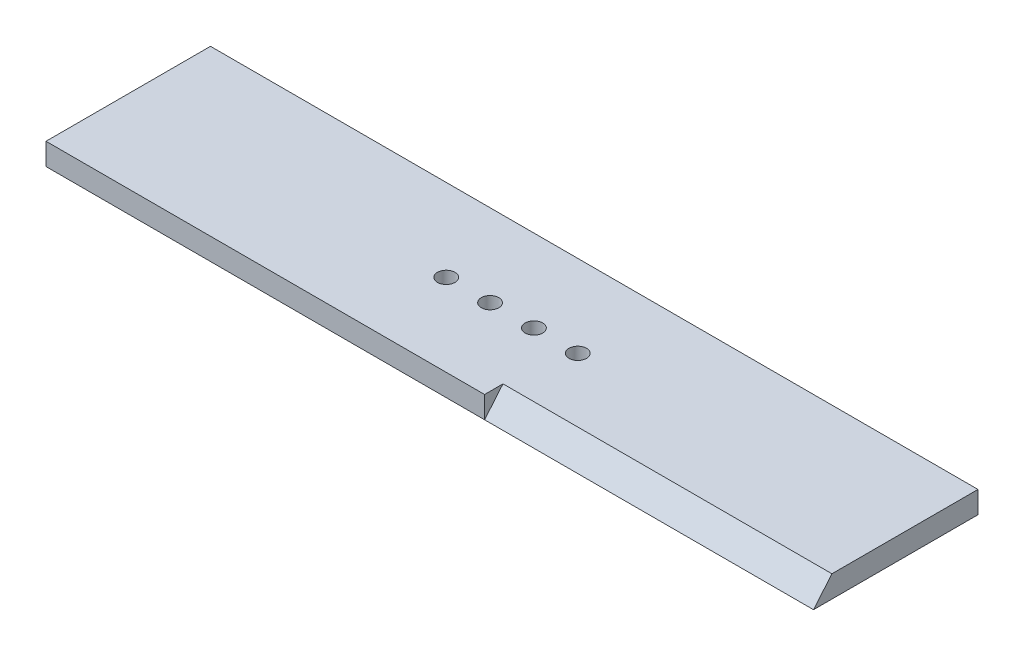
ISO-10303-21;
HEADER;
FILE_DESCRIPTION(('STEP AP214'),'2;1');
FILE_NAME('part.step','',(''),(''),'','','');
FILE_SCHEMA(('AUTOMOTIVE_DESIGN { 1 0 10303 214 1 1 1 1 }'));
ENDSEC;
DATA;
#1=APPLICATION_CONTEXT('core data for automotive mechanical design processes');
#2=APPLICATION_PROTOCOL_DEFINITION('international standard','automotive_design',2000,#1);
#3=PRODUCT_CONTEXT('',#1,'mechanical');
#4=PRODUCT('Part','Part','',(#3));
#5=PRODUCT_RELATED_PRODUCT_CATEGORY('part','',(#4));
#6=PRODUCT_DEFINITION_FORMATION('','',#4);
#7=PRODUCT_DEFINITION_CONTEXT('part definition',#1,'design');
#8=PRODUCT_DEFINITION('design','',#6,#7);
#9=PRODUCT_DEFINITION_SHAPE('','',#8);
#10=(LENGTH_UNIT() NAMED_UNIT(*) SI_UNIT(.MILLI.,.METRE.));
#11=(NAMED_UNIT(*) PLANE_ANGLE_UNIT() SI_UNIT($,.RADIAN.));
#12=(NAMED_UNIT(*) SI_UNIT($,.STERADIAN.) SOLID_ANGLE_UNIT());
#13=UNCERTAINTY_MEASURE_WITH_UNIT(LENGTH_MEASURE(1.E-05),#10,'distance_accuracy_value','');
#14=(GEOMETRIC_REPRESENTATION_CONTEXT(3) GLOBAL_UNCERTAINTY_ASSIGNED_CONTEXT((#13)) GLOBAL_UNIT_ASSIGNED_CONTEXT((#10,
#11,#12)) REPRESENTATION_CONTEXT('',''));
#15=CARTESIAN_POINT('',(0.,0.,0.));
#16=DIRECTION('',(0.,0.,1.));
#17=DIRECTION('',(1.,0.,0.));
#18=AXIS2_PLACEMENT_3D('',#15,#16,#17);
#19=CARTESIAN_POINT('',(-175.,5.,37.5));
#20=DIRECTION('',(0.,0.,-1.));
#21=DIRECTION('',(-1.,0.,0.));
#22=AXIS2_PLACEMENT_3D('',#19,#20,#21);
#23=PLANE('',#22);
#24=DIRECTION('',(0.,-1.,0.));
#25=VECTOR('',#24,1.);
#26=CARTESIAN_POINT('',(25.,5.,37.5));
#27=LINE('',#26,#25);
#28=CARTESIAN_POINT('',(25.,5.,37.5));
#29=VERTEX_POINT('',#28);
#30=CARTESIAN_POINT('',(25.,-5.,37.5));
#31=VERTEX_POINT('',#30);
#32=EDGE_CURVE('E179',#29,#31,#27,.T.);
#33=ORIENTED_EDGE('',*,*,#32,.F.);
#34=DIRECTION('',(1.,0.,0.));
#35=VECTOR('',#34,1.);
#36=CARTESIAN_POINT('',(-175.,5.,37.5));
#37=LINE('',#36,#35);
#38=CARTESIAN_POINT('',(-175.,5.,37.5));
#39=VERTEX_POINT('',#38);
#40=EDGE_CURVE('E135',#39,#29,#37,.T.);
#41=ORIENTED_EDGE('',*,*,#40,.F.);
#42=DIRECTION('',(0.,-1.,0.));
#43=VECTOR('',#42,1.);
#44=CARTESIAN_POINT('',(-175.,5.,37.5));
#45=LINE('',#44,#43);
#46=CARTESIAN_POINT('',(-175.,-5.,37.5));
#47=VERTEX_POINT('',#46);
#48=EDGE_CURVE('E48',#39,#47,#45,.T.);
#49=ORIENTED_EDGE('',*,*,#48,.T.);
#50=DIRECTION('',(1.,0.,0.));
#51=VECTOR('',#50,1.);
#52=CARTESIAN_POINT('',(-175.,-5.,37.5));
#53=LINE('',#52,#51);
#54=EDGE_CURVE('E137',#47,#31,#53,.T.);
#55=ORIENTED_EDGE('',*,*,#54,.T.);
#56=EDGE_LOOP('',(#33,#41,#49,#55));
#57=FACE_BOUND('',#56,.T.);
#58=ADVANCED_FACE('F39',(#57),#23,.F.);
#59=CARTESIAN_POINT('',(175.,5.,37.5));
#60=DIRECTION('',(-1.,0.,0.));
#61=DIRECTION('',(0.,0.,1.));
#62=AXIS2_PLACEMENT_3D('',#59,#60,#61);
#63=PLANE('',#62);
#64=DIRECTION('',(0.,0.,-1.));
#65=VECTOR('',#64,1.);
#66=CARTESIAN_POINT('',(175.,5.,37.5));
#67=LINE('',#66,#65);
#68=CARTESIAN_POINT('',(175.,5.,29.1090036882273));
#69=VERTEX_POINT('',#68);
#70=CARTESIAN_POINT('',(175.,5.,-37.5));
#71=VERTEX_POINT('',#70);
#72=EDGE_CURVE('E129',#69,#71,#67,.T.);
#73=ORIENTED_EDGE('',*,*,#72,.F.);
#74=DIRECTION('',(0.,0.766044443118981,-0.642787609686536));
#75=VECTOR('',#74,1.);
#76=CARTESIAN_POINT('',(175.,-5.,37.5));
#77=LINE('',#76,#75);
#78=CARTESIAN_POINT('',(175.,-5.,37.5));
#79=VERTEX_POINT('',#78);
#80=EDGE_CURVE('E353',#79,#69,#77,.T.);
#81=ORIENTED_EDGE('',*,*,#80,.F.);
#82=DIRECTION('',(0.,0.,-1.));
#83=VECTOR('',#82,1.);
#84=CARTESIAN_POINT('',(175.,-5.,37.5));
#85=LINE('',#84,#83);
#86=CARTESIAN_POINT('',(175.,-5.,-37.5));
#87=VERTEX_POINT('',#86);
#88=EDGE_CURVE('E144',#79,#87,#85,.T.);
#89=ORIENTED_EDGE('',*,*,#88,.T.);
#90=DIRECTION('',(0.,-1.,0.));
#91=VECTOR('',#90,1.);
#92=CARTESIAN_POINT('',(175.,5.,-37.5));
#93=LINE('',#92,#91);
#94=EDGE_CURVE('E11',#71,#87,#93,.T.);
#95=ORIENTED_EDGE('',*,*,#94,.F.);
#96=EDGE_LOOP('',(#73,#81,#89,#95));
#97=FACE_BOUND('',#96,.T.);
#98=ADVANCED_FACE('F41',(#97),#63,.F.);
#99=CARTESIAN_POINT('',(-175.,5.,-37.5));
#100=DIRECTION('',(0.,0.,1.));
#101=DIRECTION('',(1.,0.,0.));
#102=AXIS2_PLACEMENT_3D('',#99,#100,#101);
#103=PLANE('',#102);
#104=DIRECTION('',(-1.,0.,0.));
#105=VECTOR('',#104,1.);
#106=CARTESIAN_POINT('',(-175.,-5.,-37.5));
#107=LINE('',#106,#105);
#108=CARTESIAN_POINT('',(-25.,-5.,-37.5));
#109=VERTEX_POINT('',#108);
#110=EDGE_CURVE('E122',#87,#109,#107,.T.);
#111=ORIENTED_EDGE('',*,*,#110,.T.);
#112=DIRECTION('',(0.,-1.,0.));
#113=VECTOR('',#112,1.);
#114=CARTESIAN_POINT('',(-25.,5.,-37.5));
#115=LINE('',#114,#113);
#116=CARTESIAN_POINT('',(-25.,5.,-37.5));
#117=VERTEX_POINT('',#116);
#118=EDGE_CURVE('E55',#117,#109,#115,.T.);
#119=ORIENTED_EDGE('',*,*,#118,.F.);
#120=DIRECTION('',(-1.,0.,0.));
#121=VECTOR('',#120,1.);
#122=CARTESIAN_POINT('',(-175.,5.,-37.5));
#123=LINE('',#122,#121);
#124=EDGE_CURVE('E120',#71,#117,#123,.T.);
#125=ORIENTED_EDGE('',*,*,#124,.F.);
#126=ORIENTED_EDGE('',*,*,#94,.T.);
#127=EDGE_LOOP('',(#111,#119,#125,#126));
#128=FACE_BOUND('',#127,.T.);
#129=ADVANCED_FACE('F119',(#128),#103,.F.);
#130=CARTESIAN_POINT('',(-175.,5.,37.5));
#131=DIRECTION('',(1.,0.,0.));
#132=DIRECTION('',(0.,0.,-1.));
#133=AXIS2_PLACEMENT_3D('',#130,#131,#132);
#134=PLANE('',#133);
#135=DIRECTION('',(0.,0.,1.));
#136=VECTOR('',#135,1.);
#137=CARTESIAN_POINT('',(-175.,5.,37.5));
#138=LINE('',#137,#136);
#139=CARTESIAN_POINT('',(-175.,5.,-37.5));
#140=VERTEX_POINT('',#139);
#141=EDGE_CURVE('E131',#140,#39,#138,.T.);
#142=ORIENTED_EDGE('',*,*,#141,.F.);
#143=DIRECTION('',(0.,0.766044443118981,-0.642787609686536));
#144=VECTOR('',#143,1.);
#145=CARTESIAN_POINT('',(-175.,-4.99999999999998,-29.1090036882273));
#146=LINE('',#145,#144);
#147=CARTESIAN_POINT('',(-175.,-4.99999999999998,-29.1090036882273));
#148=VERTEX_POINT('',#147);
#149=EDGE_CURVE('E104',#148,#140,#146,.T.);
#150=ORIENTED_EDGE('',*,*,#149,.F.);
#151=DIRECTION('',(0.,0.,1.));
#152=VECTOR('',#151,1.);
#153=CARTESIAN_POINT('',(-175.,-5.,37.5));
#154=LINE('',#153,#152);
#155=EDGE_CURVE('E151',#148,#47,#154,.T.);
#156=ORIENTED_EDGE('',*,*,#155,.T.);
#157=ORIENTED_EDGE('',*,*,#48,.F.);
#158=EDGE_LOOP('',(#142,#150,#156,#157));
#159=FACE_BOUND('',#158,.T.);
#160=ADVANCED_FACE('F222',(#159),#134,.F.);
#161=CARTESIAN_POINT('',(0.,5.,0.));
#162=DIRECTION('',(0.,-1.,0.));
#163=DIRECTION('',(0.,0.,-1.));
#164=AXIS2_PLACEMENT_3D('',#161,#162,#163);
#165=PLANE('',#164);
#166=CARTESIAN_POINT('',(10.,5.,0.));
#167=DIRECTION('',(0.,1.,0.));
#168=DIRECTION('',(0.,0.,1.));
#169=AXIS2_PLACEMENT_3D('',#166,#167,#168);
#170=CIRCLE('',#169,4.);
#171=CARTESIAN_POINT('',(10.,5.,4.));
#172=VERTEX_POINT('',#171);
#173=EDGE_CURVE('E177',#172,#172,#170,.T.);
#174=ORIENTED_EDGE('',*,*,#173,.F.);
#175=EDGE_LOOP('',(#174));
#176=FACE_BOUND('',#175,.T.);
#177=CARTESIAN_POINT('',(30.,5.,0.));
#178=DIRECTION('',(0.,1.,0.));
#179=DIRECTION('',(0.,0.,1.));
#180=AXIS2_PLACEMENT_3D('',#177,#178,#179);
#181=CIRCLE('',#180,4.);
#182=CARTESIAN_POINT('',(30.,5.,4.00000000000002));
#183=VERTEX_POINT('',#182);
#184=EDGE_CURVE('E190',#183,#183,#181,.T.);
#185=ORIENTED_EDGE('',*,*,#184,.F.);
#186=EDGE_LOOP('',(#185));
#187=FACE_BOUND('',#186,.T.);
#188=CARTESIAN_POINT('',(-10.,5.,0.));
#189=DIRECTION('',(0.,1.,0.));
#190=DIRECTION('',(0.,0.,1.));
#191=AXIS2_PLACEMENT_3D('',#188,#189,#190);
#192=CIRCLE('',#191,4.);
#193=CARTESIAN_POINT('',(-10.,5.,4.00000000000001));
#194=VERTEX_POINT('',#193);
#195=EDGE_CURVE('E198',#194,#194,#192,.T.);
#196=ORIENTED_EDGE('',*,*,#195,.F.);
#197=EDGE_LOOP('',(#196));
#198=FACE_BOUND('',#197,.T.);
#199=CARTESIAN_POINT('',(-30.,5.,0.));
#200=DIRECTION('',(0.,1.,0.));
#201=DIRECTION('',(0.,0.,1.));
#202=AXIS2_PLACEMENT_3D('',#199,#200,#201);
#203=CIRCLE('',#202,4.);
#204=CARTESIAN_POINT('',(-30.,5.,4.00000000000001));
#205=VERTEX_POINT('',#204);
#206=EDGE_CURVE('E206',#205,#205,#203,.T.);
#207=ORIENTED_EDGE('',*,*,#206,.F.);
#208=EDGE_LOOP('',(#207));
#209=FACE_BOUND('',#208,.T.);
#210=DIRECTION('',(0.,0.,1.));
#211=VECTOR('',#210,1.);
#212=CARTESIAN_POINT('',(25.,5.,29.1090036882273));
#213=LINE('',#212,#211);
#214=CARTESIAN_POINT('',(25.,5.,29.1090036882273));
#215=VERTEX_POINT('',#214);
#216=EDGE_CURVE('E355',#215,#29,#213,.T.);
#217=ORIENTED_EDGE('',*,*,#216,.F.);
#218=DIRECTION('',(1.,0.,0.));
#219=VECTOR('',#218,1.);
#220=CARTESIAN_POINT('',(25.,5.,29.1090036882273));
#221=LINE('',#220,#219);
#222=EDGE_CURVE('E173',#215,#69,#221,.T.);
#223=ORIENTED_EDGE('',*,*,#222,.T.);
#224=ORIENTED_EDGE('',*,*,#72,.T.);
#225=ORIENTED_EDGE('',*,*,#124,.T.);
#226=DIRECTION('',(-1.,0.,0.));
#227=VECTOR('',#226,1.);
#228=CARTESIAN_POINT('',(-25.,5.,-37.5));
#229=LINE('',#228,#227);
#230=EDGE_CURVE('E100',#117,#140,#229,.T.);
#231=ORIENTED_EDGE('',*,*,#230,.T.);
#232=ORIENTED_EDGE('',*,*,#141,.T.);
#233=ORIENTED_EDGE('',*,*,#40,.T.);
#234=EDGE_LOOP('',(#217,#223,#224,#225,#231,#232,#233));
#235=FACE_BOUND('',#234,.T.);
#236=ADVANCED_FACE('F126',(#176,#187,#198,#209,#235),#165,.F.);
#237=CARTESIAN_POINT('',(0.,-5.,0.));
#238=DIRECTION('',(0.,-1.,0.));
#239=DIRECTION('',(0.,0.,-1.));
#240=AXIS2_PLACEMENT_3D('',#237,#238,#239);
#241=PLANE('',#240);
#242=DIRECTION('',(-1.,0.,0.));
#243=VECTOR('',#242,1.);
#244=CARTESIAN_POINT('',(-25.,-4.99999999999998,-29.1090036882273));
#245=LINE('',#244,#243);
#246=CARTESIAN_POINT('',(-25.,-4.99999999999998,-29.1090036882273));
#247=VERTEX_POINT('',#246);
#248=EDGE_CURVE('E109',#247,#148,#245,.T.);
#249=ORIENTED_EDGE('',*,*,#248,.F.);
#250=DIRECTION('',(0.,0.,1.));
#251=VECTOR('',#250,1.);
#252=CARTESIAN_POINT('',(-25.,-5.,-37.5));
#253=LINE('',#252,#251);
#254=EDGE_CURVE('E110',#109,#247,#253,.T.);
#255=ORIENTED_EDGE('',*,*,#254,.F.);
#256=ORIENTED_EDGE('',*,*,#110,.F.);
#257=ORIENTED_EDGE('',*,*,#88,.F.);
#258=DIRECTION('',(1.,0.,0.));
#259=VECTOR('',#258,1.);
#260=CARTESIAN_POINT('',(25.,-5.,37.5));
#261=LINE('',#260,#259);
#262=EDGE_CURVE('E170',#31,#79,#261,.T.);
#263=ORIENTED_EDGE('',*,*,#262,.F.);
#264=ORIENTED_EDGE('',*,*,#54,.F.);
#265=ORIENTED_EDGE('',*,*,#155,.F.);
#266=EDGE_LOOP('',(#249,#255,#256,#257,#263,#264,#265));
#267=FACE_BOUND('',#266,.T.);
#268=CARTESIAN_POINT('',(10.,-5.00000000000001,0.));
#269=DIRECTION('',(0.,1.,0.));
#270=DIRECTION('',(0.,0.,1.));
#271=AXIS2_PLACEMENT_3D('',#268,#269,#270);
#272=CIRCLE('',#271,3.99999999999996);
#273=CARTESIAN_POINT('',(10.,-5.00000000000001,3.99999999999996));
#274=VERTEX_POINT('',#273);
#275=EDGE_CURVE('E186',#274,#274,#272,.T.);
#276=ORIENTED_EDGE('',*,*,#275,.T.);
#277=EDGE_LOOP('',(#276));
#278=FACE_BOUND('',#277,.T.);
#279=CARTESIAN_POINT('',(30.,-5.00000000000001,0.));
#280=DIRECTION('',(0.,1.,0.));
#281=DIRECTION('',(0.,0.,1.));
#282=AXIS2_PLACEMENT_3D('',#279,#280,#281);
#283=CIRCLE('',#282,3.99999999999996);
#284=CARTESIAN_POINT('',(30.,-5.00000000000001,3.99999999999997));
#285=VERTEX_POINT('',#284);
#286=EDGE_CURVE('E194',#285,#285,#283,.T.);
#287=ORIENTED_EDGE('',*,*,#286,.T.);
#288=EDGE_LOOP('',(#287));
#289=FACE_BOUND('',#288,.T.);
#290=CARTESIAN_POINT('',(-10.,-5.00000000000001,0.));
#291=DIRECTION('',(0.,1.,0.));
#292=DIRECTION('',(0.,0.,1.));
#293=AXIS2_PLACEMENT_3D('',#290,#291,#292);
#294=CIRCLE('',#293,3.99999999999996);
#295=CARTESIAN_POINT('',(-10.,-5.00000000000001,3.99999999999996));
#296=VERTEX_POINT('',#295);
#297=EDGE_CURVE('E202',#296,#296,#294,.T.);
#298=ORIENTED_EDGE('',*,*,#297,.T.);
#299=EDGE_LOOP('',(#298));
#300=FACE_BOUND('',#299,.T.);
#301=CARTESIAN_POINT('',(-30.,-5.00000000000001,0.));
#302=DIRECTION('',(0.,1.,0.));
#303=DIRECTION('',(0.,0.,1.));
#304=AXIS2_PLACEMENT_3D('',#301,#302,#303);
#305=CIRCLE('',#304,3.99999999999996);
#306=CARTESIAN_POINT('',(-30.,-5.00000000000001,3.99999999999997));
#307=VERTEX_POINT('',#306);
#308=EDGE_CURVE('E148',#307,#307,#305,.T.);
#309=ORIENTED_EDGE('',*,*,#308,.T.);
#310=EDGE_LOOP('',(#309));
#311=FACE_BOUND('',#310,.T.);
#312=ADVANCED_FACE('F167',(#267,#278,#289,#300,#311),#241,.T.);
#313=CARTESIAN_POINT('',(-30.,5.,0.));
#314=DIRECTION('',(0.,1.,0.));
#315=DIRECTION('',(0.,0.,1.));
#316=AXIS2_PLACEMENT_3D('',#313,#314,#315);
#317=CYLINDRICAL_SURFACE('',#316,3.99999999999998);
#318=ORIENTED_EDGE('',*,*,#308,.F.);
#319=EDGE_LOOP('',(#318));
#320=FACE_BOUND('',#319,.T.);
#321=ORIENTED_EDGE('',*,*,#206,.T.);
#322=EDGE_LOOP('',(#321));
#323=FACE_BOUND('',#322,.T.);
#324=ADVANCED_FACE('F214',(#320,#323),#317,.F.);
#325=CARTESIAN_POINT('',(-10.,5.,0.));
#326=DIRECTION('',(0.,1.,0.));
#327=DIRECTION('',(0.,0.,1.));
#328=AXIS2_PLACEMENT_3D('',#325,#326,#327);
#329=CYLINDRICAL_SURFACE('',#328,3.99999999999998);
#330=ORIENTED_EDGE('',*,*,#297,.F.);
#331=EDGE_LOOP('',(#330));
#332=FACE_BOUND('',#331,.T.);
#333=ORIENTED_EDGE('',*,*,#195,.T.);
#334=EDGE_LOOP('',(#333));
#335=FACE_BOUND('',#334,.T.);
#336=ADVANCED_FACE('F217',(#332,#335),#329,.F.);
#337=CARTESIAN_POINT('',(30.,5.,0.));
#338=DIRECTION('',(0.,1.,0.));
#339=DIRECTION('',(0.,0.,1.));
#340=AXIS2_PLACEMENT_3D('',#337,#338,#339);
#341=CYLINDRICAL_SURFACE('',#340,3.99999999999998);
#342=ORIENTED_EDGE('',*,*,#286,.F.);
#343=EDGE_LOOP('',(#342));
#344=FACE_BOUND('',#343,.T.);
#345=ORIENTED_EDGE('',*,*,#184,.T.);
#346=EDGE_LOOP('',(#345));
#347=FACE_BOUND('',#346,.T.);
#348=ADVANCED_FACE('F292',(#344,#347),#341,.F.);
#349=CARTESIAN_POINT('',(10.,5.,0.));
#350=DIRECTION('',(0.,1.,0.));
#351=DIRECTION('',(0.,0.,1.));
#352=AXIS2_PLACEMENT_3D('',#349,#350,#351);
#353=CYLINDRICAL_SURFACE('',#352,3.99999999999998);
#354=ORIENTED_EDGE('',*,*,#275,.F.);
#355=EDGE_LOOP('',(#354));
#356=FACE_BOUND('',#355,.T.);
#357=ORIENTED_EDGE('',*,*,#173,.T.);
#358=EDGE_LOOP('',(#357));
#359=FACE_BOUND('',#358,.T.);
#360=ADVANCED_FACE('F289',(#356,#359),#353,.F.);
#361=CARTESIAN_POINT('',(25.,-5.,37.5));
#362=DIRECTION('',(0.,-0.642787609686536,-0.766044443118981));
#363=DIRECTION('',(0.,0.766044443118981,-0.642787609686536));
#364=AXIS2_PLACEMENT_3D('',#361,#362,#363);
#365=PLANE('',#364);
#366=ORIENTED_EDGE('',*,*,#80,.T.);
#367=ORIENTED_EDGE('',*,*,#222,.F.);
#368=DIRECTION('',(0.,0.766044443118981,-0.642787609686536));
#369=VECTOR('',#368,1.);
#370=CARTESIAN_POINT('',(25.,-5.,37.5));
#371=LINE('',#370,#369);
#372=EDGE_CURVE('E63',#31,#215,#371,.T.);
#373=ORIENTED_EDGE('',*,*,#372,.F.);
#374=ORIENTED_EDGE('',*,*,#262,.T.);
#375=EDGE_LOOP('',(#366,#367,#373,#374));
#376=FACE_BOUND('',#375,.T.);
#377=ADVANCED_FACE('F285',(#376),#365,.F.);
#378=CARTESIAN_POINT('',(25.,0.,0.));
#379=DIRECTION('',(1.,0.,0.));
#380=DIRECTION('',(0.,0.,-1.));
#381=AXIS2_PLACEMENT_3D('',#378,#379,#380);
#382=PLANE('',#381);
#383=ORIENTED_EDGE('',*,*,#216,.T.);
#384=ORIENTED_EDGE('',*,*,#32,.T.);
#385=ORIENTED_EDGE('',*,*,#372,.T.);
#386=EDGE_LOOP('',(#383,#384,#385));
#387=FACE_BOUND('',#386,.T.);
#388=ADVANCED_FACE('F269',(#387),#382,.T.);
#389=CARTESIAN_POINT('',(-25.,-4.99999999999998,-29.1090036882273));
#390=DIRECTION('',(0.,0.642787609686536,0.766044443118981));
#391=DIRECTION('',(0.,-0.766044443118981,0.642787609686536));
#392=AXIS2_PLACEMENT_3D('',#389,#390,#391);
#393=PLANE('',#392);
#394=ORIENTED_EDGE('',*,*,#149,.T.);
#395=ORIENTED_EDGE('',*,*,#230,.F.);
#396=DIRECTION('',(0.,0.766044443118981,-0.642787609686536));
#397=VECTOR('',#396,1.);
#398=CARTESIAN_POINT('',(-25.,-4.99999999999998,-29.1090036882273));
#399=LINE('',#398,#397);
#400=EDGE_CURVE('E102',#247,#117,#399,.T.);
#401=ORIENTED_EDGE('',*,*,#400,.F.);
#402=ORIENTED_EDGE('',*,*,#248,.T.);
#403=EDGE_LOOP('',(#394,#395,#401,#402));
#404=FACE_BOUND('',#403,.T.);
#405=ADVANCED_FACE('F101',(#404),#393,.F.);
#406=CARTESIAN_POINT('',(-25.,0.,0.));
#407=DIRECTION('',(1.,0.,0.));
#408=DIRECTION('',(0.,0.,-1.));
#409=AXIS2_PLACEMENT_3D('',#406,#407,#408);
#410=PLANE('',#409);
#411=ORIENTED_EDGE('',*,*,#400,.T.);
#412=ORIENTED_EDGE('',*,*,#118,.T.);
#413=ORIENTED_EDGE('',*,*,#254,.T.);
#414=EDGE_LOOP('',(#411,#412,#413));
#415=FACE_BOUND('',#414,.T.);
#416=ADVANCED_FACE('F112',(#415),#410,.F.);
#417=CLOSED_SHELL('',(#58,#98,#129,#160,#236,#312,#324,#336,#348,#360,#377,#388,#405,#416));
#418=MANIFOLD_SOLID_BREP('B2',#417);
#419=ADVANCED_BREP_SHAPE_REPRESENTATION('',(#18,#418),#14);
#420=SHAPE_DEFINITION_REPRESENTATION(#9,#419);
ENDSEC;
END-ISO-10303-21;
